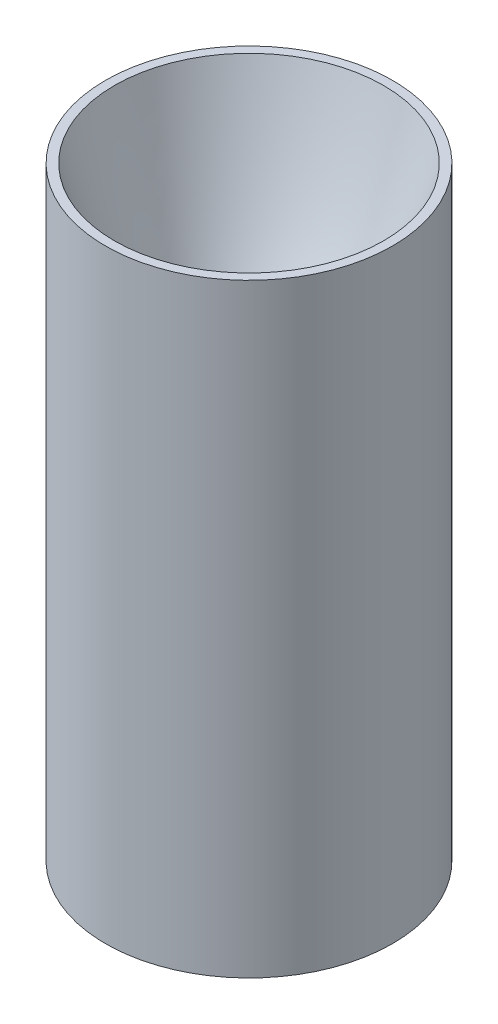
ISO-10303-21;
HEADER;
FILE_DESCRIPTION(('STEP AP214'),'2;1');
FILE_NAME('part.step','',(''),(''),'','','');
FILE_SCHEMA(('AUTOMOTIVE_DESIGN { 1 0 10303 214 1 1 1 1 }'));
ENDSEC;
DATA;
#1=APPLICATION_CONTEXT('core data for automotive mechanical design processes');
#2=APPLICATION_PROTOCOL_DEFINITION('international standard','automotive_design',2000,#1);
#3=PRODUCT_CONTEXT('',#1,'mechanical');
#4=PRODUCT('Part','Part','',(#3));
#5=PRODUCT_RELATED_PRODUCT_CATEGORY('part','',(#4));
#6=PRODUCT_DEFINITION_FORMATION('','',#4);
#7=PRODUCT_DEFINITION_CONTEXT('part definition',#1,'design');
#8=PRODUCT_DEFINITION('design','',#6,#7);
#9=PRODUCT_DEFINITION_SHAPE('','',#8);
#10=(LENGTH_UNIT() NAMED_UNIT(*) SI_UNIT(.MILLI.,.METRE.));
#11=(NAMED_UNIT(*) PLANE_ANGLE_UNIT() SI_UNIT($,.RADIAN.));
#12=(NAMED_UNIT(*) SI_UNIT($,.STERADIAN.) SOLID_ANGLE_UNIT());
#13=UNCERTAINTY_MEASURE_WITH_UNIT(LENGTH_MEASURE(1.E-05),#10,'distance_accuracy_value','');
#14=(GEOMETRIC_REPRESENTATION_CONTEXT(3) GLOBAL_UNCERTAINTY_ASSIGNED_CONTEXT((#13)) GLOBAL_UNIT_ASSIGNED_CONTEXT((#10,
#11,#12)) REPRESENTATION_CONTEXT('',''));
#15=CARTESIAN_POINT('',(0.,0.,0.));
#16=DIRECTION('',(0.,0.,1.));
#17=DIRECTION('',(1.,0.,0.));
#18=AXIS2_PLACEMENT_3D('',#15,#16,#17);
#19=CARTESIAN_POINT('',(-0.00553212594954357,165.815985113531,0.));
#20=DIRECTION('',(0.,1.,0.));
#21=DIRECTION('',(-1.,0.,0.));
#22=AXIS2_PLACEMENT_3D('',#19,#20,#21);
#23=CYLINDRICAL_SURFACE('',#22,53.8870597874087);
#24=CARTESIAN_POINT('',(-0.00553212594952976,-59.7275132222084,0.));
#25=DIRECTION('',(0.,1.,0.));
#26=DIRECTION('',(-1.,0.,0.));
#27=AXIS2_PLACEMENT_3D('',#24,#25,#26);
#28=CIRCLE('',#27,53.8870597874087);
#29=CARTESIAN_POINT('',(-53.8925919133582,-59.7275132222084,0.));
#30=VERTEX_POINT('',#29);
#31=EDGE_CURVE('E214',#30,#30,#28,.T.);
#32=ORIENTED_EDGE('',*,*,#31,.T.);
#33=EDGE_LOOP('',(#32));
#34=FACE_BOUND('',#33,.T.);
#35=CARTESIAN_POINT('',(-0.00553212594952079,-206.127513222208,0.));
#36=DIRECTION('',(0.,-1.,0.));
#37=DIRECTION('',(1.,0.,0.));
#38=AXIS2_PLACEMENT_3D('',#35,#36,#37);
#39=CIRCLE('',#38,53.8870597874087);
#40=CARTESIAN_POINT('',(53.8815276614592,-206.127513222208,0.));
#41=VERTEX_POINT('',#40);
#42=EDGE_CURVE('E49',#41,#41,#39,.F.);
#43=ORIENTED_EDGE('',*,*,#42,.F.);
#44=EDGE_LOOP('',(#43));
#45=FACE_BOUND('',#44,.T.);
#46=ADVANCED_FACE('F44',(#34,#45),#23,.F.);
#47=CARTESIAN_POINT('',(26.7952792027638,6.50940032261705,0.));
#48=CARTESIAN_POINT('',(26.7445202608389,6.45863951352258,0.));
#49=CARTESIAN_POINT('',(26.6704420702071,6.38228245129657,0.));
#50=CARTESIAN_POINT('',(26.5045552478799,6.20880231838131,0.));
#51=CARTESIAN_POINT('',(26.3663457558084,6.0501123088261,0.));
#52=CARTESIAN_POINT('',(26.1788763741962,5.83307431955689,0.));
#53=CARTESIAN_POINT('',(26.0044054743904,5.61088821502492,0.));
#54=CARTESIAN_POINT('',(25.7917882699891,5.32567960819241,0.));
#55=CARTESIAN_POINT('',(25.6025147209982,5.0458645334822,0.));
#56=CARTESIAN_POINT('',(25.41648850457,4.75146224774109,0.));
#57=CARTESIAN_POINT('',(25.2460122224941,4.45494379501456,0.));
#58=CARTESIAN_POINT('',(25.0840703005529,4.14944285659226,0.));
#59=CARTESIAN_POINT('',(24.935285976811,3.8398274049797,0.));
#60=CARTESIAN_POINT('',(24.7971967711735,3.52378782945289,0.));
#61=CARTESIAN_POINT('',(24.6716190705559,3.20350771325653,0.));
#62=CARTESIAN_POINT('',(24.5577414131155,2.87825331698411,0.));
#63=CARTESIAN_POINT('',(24.4563235712815,2.54940009295196,0.));
#64=CARTESIAN_POINT('',(24.3671416013245,2.21651509223236,0.));
#65=CARTESIAN_POINT('',(24.2905437014453,1.88115744920019,0.));
#66=CARTESIAN_POINT('',(24.2264993053653,1.54221117006489,0.));
#67=CARTESIAN_POINT('',(24.1751847188441,1.20269794512489,0.));
#68=CARTESIAN_POINT('',(24.1414350870908,0.90159400009664,0.));
#69=CARTESIAN_POINT('',(24.1205335987741,0.646924938525799,0.));
#70=CARTESIAN_POINT('',(24.1084615678794,0.427224789349872,0.));
#71=CARTESIAN_POINT('',(24.1020237227721,0.267801741635842,0.));
#72=CARTESIAN_POINT('',(24.099606331446,0.110274361763279,0.));
#73=CARTESIAN_POINT('',(24.0990685004946,0.0360533244193808,0.));
#74=CARTESIAN_POINT('',(24.0990678740505,0.000160672239889663,0.));
#75=B_SPLINE_CURVE_WITH_KNOTS('',4,(#47,#48,#49,#50,#51,#52,#53,#54,#55,#56,#57,#58,#59,#60,#61,
#62,#63,#64,#65,#66,#67,#68,#69,#70,#71,#72,#73,#74),.UNSPECIFIED.,.F.,.F.,(5,1,1,1,1,1,1,1,1,1,
1,1,1,1,1,1,1,1,1,1,1,1,1,1,5),(0.0825688161645696,0.122284452541055,0.142142270729318,
0.162000088917581,0.201715725294151,0.241431361670644,0.281146998047181,0.320862634423759,
0.360578270800262,0.400293907176806,0.440009543553384,0.479725179929891,0.519440816306429,
0.55915645268299,0.598872089059496,0.638587725436031,0.678303361812587,0.718018998189109,
0.75773463456565,0.797450270942201,0.837165907318734,0.857023725507005,0.876881543695275,
0.896739361883545,0.916597180071815),.UNSPECIFIED.);
#76=CARTESIAN_POINT('',(-0.00553212594954357,165.815985113531,0.));
#77=DIRECTION('',(0.,1.,0.));
#78=AXIS1_PLACEMENT('',#76,#77);
#79=SURFACE_OF_REVOLUTION('',#75,#78);
#80=CARTESIAN_POINT('',(-0.00553212594953341,0.000160668806897801,0.));
#81=DIRECTION('',(0.,1.,0.));
#82=DIRECTION('',(-1.,0.,0.));
#83=AXIS2_PLACEMENT_3D('',#80,#81,#82);
#84=CIRCLE('',#83,24.1046000000001);
#85=CARTESIAN_POINT('',(-24.1101321259496,0.000160668806896325,0.));
#86=VERTEX_POINT('',#85);
#87=EDGE_CURVE('E11',#86,#86,#84,.T.);
#88=ORIENTED_EDGE('',*,*,#87,.F.);
#89=EDGE_LOOP('',(#88));
#90=FACE_BOUND('',#89,.T.);
#91=CARTESIAN_POINT('',(-0.00553212594953381,6.50940032262515,0.));
#92=DIRECTION('',(0.,1.,0.));
#93=DIRECTION('',(-1.,0.,0.));
#94=AXIS2_PLACEMENT_3D('',#91,#92,#93);
#95=CIRCLE('',#94,26.8008113287012);
#96=CARTESIAN_POINT('',(-26.8063434546508,6.50940032262515,0.));
#97=VERTEX_POINT('',#96);
#98=EDGE_CURVE('E140',#97,#97,#95,.T.);
#99=ORIENTED_EDGE('',*,*,#98,.T.);
#100=EDGE_LOOP('',(#99));
#101=FACE_BOUND('',#100,.T.);
#102=ADVANCED_FACE('F46',(#90,#101),#79,.T.);
#103=CARTESIAN_POINT('',(24.0990678740505,0.000160668806908237,0.));
#104=CARTESIAN_POINT('',(24.0990691047264,-0.0703679737352121,0.));
#105=CARTESIAN_POINT('',(24.0995982518238,-0.213423516364572,0.));
#106=CARTESIAN_POINT('',(24.1019739368555,-0.54302224256361,0.));
#107=CARTESIAN_POINT('',(24.108298330907,-0.823999723304706,0.));
#108=CARTESIAN_POINT('',(24.1177834518131,-1.19466139823137,0.));
#109=CARTESIAN_POINT('',(24.1304257444764,-1.51327438485323,0.));
#110=CARTESIAN_POINT('',(24.1462259682127,-1.86177892979882,0.));
#111=CARTESIAN_POINT('',(24.1651812265557,-2.19354619837348,0.));
#112=CARTESIAN_POINT('',(24.1928188404899,-2.61790872656857,0.));
#113=CARTESIAN_POINT('',(24.2322870469681,-3.12187327355973,0.));
#114=CARTESIAN_POINT('',(24.3032997069299,-3.87981800184723,0.));
#115=CARTESIAN_POINT('',(24.4231266778129,-4.88628971541376,0.));
#116=CARTESIAN_POINT('',(24.5994860436425,-6.05655008801696,0.));
#117=CARTESIAN_POINT('',(24.8508852327055,-7.38500574307494,0.));
#118=CARTESIAN_POINT('',(25.1517953130835,-8.7034138434872,0.));
#119=CARTESIAN_POINT('',(25.5017706231346,-10.0094765384076,0.));
#120=CARTESIAN_POINT('',(25.9003609832371,-11.3016589273833,0.));
#121=CARTESIAN_POINT('',(26.3469453915683,-12.5779386666623,0.));
#122=CARTESIAN_POINT('',(26.8410033225458,-13.8367268168494,0.));
#123=CARTESIAN_POINT('',(27.3816731216984,-15.0760364628828,0.));
#124=CARTESIAN_POINT('',(27.9684793864403,-16.2944491292128,0.));
#125=CARTESIAN_POINT('',(28.6001393975275,-17.4897781307818,0.));
#126=CARTESIAN_POINT('',(29.2765323957794,-18.6611270954326,0.));
#127=CARTESIAN_POINT('',(29.9954451018022,-19.8055827365355,0.));
#128=CARTESIAN_POINT('',(30.7580219993831,-20.9236994165562,0.));
#129=CARTESIAN_POINT('',(31.4591671926042,-21.8742511036734,0.));
#130=CARTESIAN_POINT('',(32.088736122994,-22.6732848253228,0.));
#131=CARTESIAN_POINT('',(32.6241284164022,-23.3202614843186,0.));
#132=CARTESIAN_POINT('',(33.0722557680798,-23.8398443636278,0.));
#133=CARTESIAN_POINT('',(33.5084500261274,-24.3296555943667,0.));
#134=CARTESIAN_POINT('',(33.9358261213152,-24.7883237389104,0.));
#135=CARTESIAN_POINT('',(34.2455586397423,-25.1137076600497,0.));
#136=CARTESIAN_POINT('',(34.536859957545,-25.4094883973448,0.));
#137=CARTESIAN_POINT('',(34.6364124254986,-25.5097892828568,0.));
#138=CARTESIAN_POINT('',(34.6862828032075,-25.5596614679656,0.));
#139=B_SPLINE_CURVE_WITH_KNOTS('',4,(#103,#104,#105,#106,#107,#108,#109,#110,#111,#112,#113,
#114,#115,#116,#117,#118,#119,#120,#121,#122,#123,#124,#125,#126,#127,#128,#129,#130,#131,#132,
#133,#134,#135,#136,#137,#138),.UNSPECIFIED.,.F.,.F.,(5,1,1,1,1,1,1,1,1,1,1,1,1,1,1,1,1,1,1,1,1,
1,1,1,1,1,1,1,1,1,1,1,5),(0.0826377293963901,0.0925749264345495,0.10251212335078,
0.11244932026701,0.122386517183241,0.132323714099471,0.142260911015702,0.152198107931932,
0.162135304848163,0.182009698680624,0.201884092513085,0.241632880178006,0.281381667842927,
0.321130455507848,0.360879243172768,0.400628030837689,0.44037681850261,0.480125606167531,
0.519874393832452,0.559623181497373,0.599371969162294,0.639120756827214,0.678869544492136,
0.718618332157059,0.758367119821983,0.798115907486907,0.817990301319368,0.837864695151829,
0.857739088984291,0.877613482816753,0.897487876649217,0.907425073565449,0.917362270357466),.UNSPECIFIED.);
#140=CARTESIAN_POINT('',(-0.00553212594954357,165.815985113531,0.));
#141=DIRECTION('',(0.,1.,0.));
#142=AXIS1_PLACEMENT('',#140,#141);
#143=SURFACE_OF_REVOLUTION('',#139,#142);
#144=CARTESIAN_POINT('',(-0.00553212594953185,-25.5596614655476,0.));
#145=DIRECTION('',(0.,1.,0.));
#146=DIRECTION('',(-1.,0.,0.));
#147=AXIS2_PLACEMENT_3D('',#144,#145,#146);
#148=CIRCLE('',#147,34.6918149267068);
#149=CARTESIAN_POINT('',(-34.6973470526563,-25.5596614655476,0.));
#150=VERTEX_POINT('',#149);
#151=EDGE_CURVE('E55',#150,#150,#148,.T.);
#152=ORIENTED_EDGE('',*,*,#151,.F.);
#153=EDGE_LOOP('',(#152));
#154=FACE_BOUND('',#153,.T.);
#155=ORIENTED_EDGE('',*,*,#87,.T.);
#156=EDGE_LOOP('',(#155));
#157=FACE_BOUND('',#156,.T.);
#158=ADVANCED_FACE('F159',(#154,#157),#143,.T.);
#159=CARTESIAN_POINT('',(-0.00553212594953185,-25.5596614655476,0.));
#160=DIRECTION('',(0.,-1.,0.));
#161=DIRECTION('',(1.,0.,0.));
#162=AXIS2_PLACEMENT_3D('',#159,#160,#161);
#163=CONICAL_SURFACE('',#162,34.6918149267068,0.785398163436923);
#164=CARTESIAN_POINT('',(-0.00553212594953132,-34.1672896564155,0.));
#165=DIRECTION('',(0.,1.,0.));
#166=DIRECTION('',(-1.,0.,0.));
#167=AXIS2_PLACEMENT_3D('',#164,#165,#166);
#168=CIRCLE('',#167,43.2994431182542);
#169=CARTESIAN_POINT('',(-43.3049752442037,-34.1672896564155,0.));
#170=VERTEX_POINT('',#169);
#171=EDGE_CURVE('E218',#170,#170,#168,.T.);
#172=ORIENTED_EDGE('',*,*,#171,.F.);
#173=EDGE_LOOP('',(#172));
#174=FACE_BOUND('',#173,.T.);
#175=ORIENTED_EDGE('',*,*,#151,.T.);
#176=EDGE_LOOP('',(#175));
#177=FACE_BOUND('',#176,.T.);
#178=ADVANCED_FACE('F162',(#174,#177),#163,.F.);
#179=CARTESIAN_POINT('',(43.2939109923046,-34.1672896564155,0.));
#180=CARTESIAN_POINT('',(43.3437831513223,-34.2171620551714,0.));
#181=CARTESIAN_POINT('',(43.4443920727492,-34.3185162876524,0.));
#182=CARTESIAN_POINT('',(43.6740724065625,-34.5515494508273,0.));
#183=CARTESIAN_POINT('',(43.8739246242924,-34.7603401511495,0.));
#184=CARTESIAN_POINT('',(44.1814575029394,-35.0846311851452,0.));
#185=CARTESIAN_POINT('',(44.5147761897921,-35.4469926571794,0.));
#186=CARTESIAN_POINT('',(44.9151269482091,-35.8942476326121,0.));
#187=CARTESIAN_POINT('',(45.3528176805606,-36.4033812820872,0.));
#188=CARTESIAN_POINT('',(45.8935379372936,-37.0556721225026,0.));
#189=CARTESIAN_POINT('',(46.5198690603663,-37.8514517850733,0.));
#190=CARTESIAN_POINT('',(47.2231021380089,-38.8040762391045,0.));
#191=CARTESIAN_POINT('',(47.9844755196269,-39.9209726571504,0.));
#192=CARTESIAN_POINT('',(48.7041252288017,-41.0661548789494,0.));
#193=CARTESIAN_POINT('',(49.3801202305322,-42.237093238969,0.));
#194=CARTESIAN_POINT('',(50.0120609277141,-43.4327015259013,0.));
#195=CARTESIAN_POINT('',(50.5987337525416,-44.6509688035954,0.));
#196=CARTESIAN_POINT('',(51.1395203608935,-45.8904084054128,0.));
#197=CARTESIAN_POINT('',(51.6335378309109,-47.1491350671244,0.));
#198=CARTESIAN_POINT('',(52.0243487391707,-48.2659692236755,0.));
#199=CARTESIAN_POINT('',(52.3292893402464,-49.2330777402432,0.));
#200=CARTESIAN_POINT('',(52.6100142242714,-50.2074890382386,0.));
#201=CARTESIAN_POINT('',(52.8663751202277,-51.1885390834316,0.));
#202=CARTESIAN_POINT('',(53.0920641868644,-52.1774428213628,0.));
#203=CARTESIAN_POINT('',(53.286810822161,-53.1724252398257,0.));
#204=CARTESIAN_POINT('',(53.4566757862888,-54.1724354302666,0.));
#205=CARTESIAN_POINT('',(53.5774268613503,-55.0081658604085,0.));
#206=CARTESIAN_POINT('',(53.6772884517024,-55.8484803658293,0.));
#207=CARTESIAN_POINT('',(53.7561931214081,-56.6879981651896,0.));
#208=CARTESIAN_POINT('',(53.8004052846286,-57.2809598991543,0.));
#209=CARTESIAN_POINT('',(53.8304176255881,-57.78159444267,0.));
#210=CARTESIAN_POINT('',(53.8501684533724,-58.2128376217517,0.));
#211=CARTESIAN_POINT('',(53.8628113509311,-58.532567487684,0.));
#212=CARTESIAN_POINT('',(53.8722968380062,-58.9047954926748,0.));
#213=CARTESIAN_POINT('',(53.8786214368661,-59.1815646164516,0.));
#214=CARTESIAN_POINT('',(53.8809972871444,-59.5154061029223,0.));
#215=CARTESIAN_POINT('',(53.8815264301114,-59.6569831565778,0.));
#216=CARTESIAN_POINT('',(53.881527661459,-59.7275132097554,0.));
#217=B_SPLINE_CURVE_WITH_KNOTS('',4,(#179,#180,#181,#182,#183,#184,#185,#186,#187,#188,#189,
#190,#191,#192,#193,#194,#195,#196,#197,#198,#199,#200,#201,#202,#203,#204,#205,#206,#207,#208,
#209,#210,#211,#212,#213,#214,#215,#216),.UNSPECIFIED.,.F.,.F.,(5,1,1,1,1,1,1,1,1,1,1,1,1,1,1,1,
1,1,1,1,1,1,1,1,1,1,1,1,1,1,1,1,1,1,5),(0.0826377290758682,0.092574925554141,0.102512122470373,
0.112449319386606,0.122386516302838,0.142260910135299,0.162135303967759,0.18200969780022,
0.201884091632681,0.241632879297603,0.281381666962524,0.321130454627446,0.360879242292367,
0.400628029957289,0.440376817622211,0.480125605287132,0.519874392952054,0.559623180616974,
0.599371968281896,0.619246362114357,0.639120755946818,0.67886954361174,0.718618331276661,
0.738492725109122,0.758367118941582,0.798115906606503,0.817990300438964,0.837864694271425,
0.857739088103886,0.867676285020117,0.877613481936347,0.887550678852578,0.897487875768808,
0.907425072685039,0.917362270043718),.UNSPECIFIED.);
#218=CARTESIAN_POINT('',(-0.00553212594954357,165.815985113531,0.));
#219=DIRECTION('',(0.,1.,0.));
#220=AXIS1_PLACEMENT('',#218,#219);
#221=SURFACE_OF_REVOLUTION('',#217,#220);
#222=ORIENTED_EDGE('',*,*,#31,.F.);
#223=EDGE_LOOP('',(#222));
#224=FACE_BOUND('',#223,.T.);
#225=ORIENTED_EDGE('',*,*,#171,.T.);
#226=EDGE_LOOP('',(#225));
#227=FACE_BOUND('',#226,.T.);
#228=ADVANCED_FACE('F166',(#224,#227),#221,.T.);
#229=CARTESIAN_POINT('',(76.4900236023066,-212.127513222208,0.));
#230=DIRECTION('',(0.,1.,0.));
#231=DIRECTION('',(-1.,0.,0.));
#232=AXIS2_PLACEMENT_3D('',#229,#230,#231);
#233=PLANE('',#232);
#234=CARTESIAN_POINT('',(0.,-212.127513222208,0.));
#235=DIRECTION('',(0.,-1.,0.));
#236=DIRECTION('',(1.,0.,0.));
#237=AXIS2_PLACEMENT_3D('',#234,#235,#236);
#238=CIRCLE('',#237,56.8815276614404);
#239=CARTESIAN_POINT('',(56.8815276614404,-212.127513222208,0.));
#240=VERTEX_POINT('',#239);
#241=EDGE_CURVE('E102',#240,#240,#238,.T.);
#242=ORIENTED_EDGE('',*,*,#241,.F.);
#243=EDGE_LOOP('',(#242));
#244=FACE_BOUND('',#243,.T.);
#245=CARTESIAN_POINT('',(46.1032838079609,-212.127513222208,46.1035512337718));
#246=DIRECTION('',(0.,1.,0.));
#247=DIRECTION('',(0.38268343232144,0.,-0.923879532529367));
#248=AXIS2_PLACEMENT_3D('',#245,#246,#247);
#249=ELLIPSE('',#248,4.21640000033001,4.21639999999999);
#250=CARTESIAN_POINT('',(47.7168302321273,-212.127513222208,42.20810557251));
#251=VERTEX_POINT('',#250);
#252=EDGE_CURVE('E92',#251,#251,#249,.T.);
#253=ORIENTED_EDGE('',*,*,#252,.T.);
#254=EDGE_LOOP('',(#253));
#255=FACE_BOUND('',#254,.T.);
#256=CARTESIAN_POINT('',(-0.000267431971473179,-212.127513222208,65.2002674406839));
#257=DIRECTION('',(0.,1.,0.));
#258=DIRECTION('',(0.707106781139304,0.,-0.707106781233791));
#259=AXIS2_PLACEMENT_3D('',#256,#257,#258);
#260=ELLIPSE('',#259,4.21640000112674,4.21639999999999);
#261=CARTESIAN_POINT('',(2.98117760082102,-212.127513222208,62.2188224074931));
#262=VERTEX_POINT('',#261);
#263=EDGE_CURVE('E107',#262,#262,#260,.T.);
#264=ORIENTED_EDGE('',*,*,#263,.T.);
#265=EDGE_LOOP('',(#264));
#266=FACE_BOUND('',#265,.T.);
#267=CARTESIAN_POINT('',(-46.1038186893277,-212.127513222208,46.1035512511962));
#268=DIRECTION('',(0.,1.,0.));
#269=DIRECTION('',(0.923879532493207,0.,-0.382683432408738));
#270=AXIS2_PLACEMENT_3D('',#267,#268,#269);
#271=ELLIPSE('',#270,4.21640000192348,4.21639999999999);
#272=CARTESIAN_POINT('',(-42.2083730267463,-212.127513222208,44.4900048260519));
#273=VERTEX_POINT('',#272);
#274=EDGE_CURVE('E112',#273,#273,#271,.T.);
#275=ORIENTED_EDGE('',*,*,#274,.T.);
#276=EDGE_LOOP('',(#275));
#277=FACE_BOUND('',#276,.T.);
#278=CARTESIAN_POINT('',(-65.2005348987914,-212.127513222208,0.));
#279=DIRECTION('',(0.,1.,0.));
#280=DIRECTION('',(1.,0.,0.));
#281=AXIS2_PLACEMENT_3D('',#278,#279,#280);
#282=ELLIPSE('',#281,4.21640000225349,4.21639999999999);
#283=CARTESIAN_POINT('',(-60.9841348965379,-212.127513222208,0.));
#284=VERTEX_POINT('',#283);
#285=EDGE_CURVE('E117',#284,#284,#282,.T.);
#286=ORIENTED_EDGE('',*,*,#285,.T.);
#287=EDGE_LOOP('',(#286));
#288=FACE_BOUND('',#287,.T.);
#289=CARTESIAN_POINT('',(-46.1038186893284,-212.127513222208,-46.1035512511956));
#290=DIRECTION('',(0.,1.,0.));
#291=DIRECTION('',(0.92387953249321,0.,0.382683432408731));
#292=AXIS2_PLACEMENT_3D('',#289,#290,#291);
#293=ELLIPSE('',#292,4.21640000192348,4.21639999999999);
#294=CARTESIAN_POINT('',(-42.2083730267469,-212.127513222208,-44.4900048260513));
#295=VERTEX_POINT('',#294);
#296=EDGE_CURVE('E122',#295,#295,#293,.T.);
#297=ORIENTED_EDGE('',*,*,#296,.T.);
#298=EDGE_LOOP('',(#297));
#299=FACE_BOUND('',#298,.T.);
#300=CARTESIAN_POINT('',(-0.000267431972383761,-212.127513222208,-65.2002674406839));
#301=DIRECTION('',(0.,1.,0.));
#302=DIRECTION('',(0.707106781139309,0.,0.707106781233786));
#303=AXIS2_PLACEMENT_3D('',#300,#301,#302);
#304=ELLIPSE('',#303,4.21640000112674,4.21639999999999);
#305=CARTESIAN_POINT('',(2.98117760082012,-212.127513222208,-62.2188224074931));
#306=VERTEX_POINT('',#305);
#307=EDGE_CURVE('E127',#306,#306,#304,.T.);
#308=ORIENTED_EDGE('',*,*,#307,.T.);
#309=EDGE_LOOP('',(#308));
#310=FACE_BOUND('',#309,.T.);
#311=CARTESIAN_POINT('',(46.1032838079602,-212.127513222208,-46.1035512337724));
#312=DIRECTION('',(0.,1.,0.));
#313=DIRECTION('',(0.382683432321446,0.,0.923879532529364));
#314=AXIS2_PLACEMENT_3D('',#311,#312,#313);
#315=ELLIPSE('',#314,4.21640000033001,4.21639999999999);
#316=CARTESIAN_POINT('',(47.7168302321267,-212.127513222208,-42.2081055725107));
#317=VERTEX_POINT('',#316);
#318=EDGE_CURVE('E132',#317,#317,#315,.T.);
#319=ORIENTED_EDGE('',*,*,#318,.T.);
#320=EDGE_LOOP('',(#319));
#321=FACE_BOUND('',#320,.T.);
#322=CARTESIAN_POINT('',(65.2,-212.127513222208,0.));
#323=DIRECTION('',(0.,-1.,0.));
#324=DIRECTION('',(0.,0.,-1.));
#325=AXIS2_PLACEMENT_3D('',#322,#323,#324);
#326=CIRCLE('',#325,4.21639999999999);
#327=CARTESIAN_POINT('',(65.2,-212.127513222208,-4.21639999999999));
#328=VERTEX_POINT('',#327);
#329=EDGE_CURVE('E133',#328,#328,#326,.T.);
#330=ORIENTED_EDGE('',*,*,#329,.F.);
#331=EDGE_LOOP('',(#330));
#332=FACE_BOUND('',#331,.T.);
#333=CARTESIAN_POINT('',(-0.00553212594952042,-212.127513222208,0.));
#334=DIRECTION('',(0.,1.,0.));
#335=DIRECTION('',(-1.,0.,0.));
#336=AXIS2_PLACEMENT_3D('',#333,#334,#335);
#337=CIRCLE('',#336,76.4955557282561);
#338=CARTESIAN_POINT('',(-76.5010878542056,-212.127513222208,0.));
#339=VERTEX_POINT('',#338);
#340=EDGE_CURVE('E210',#339,#339,#337,.T.);
#341=ORIENTED_EDGE('',*,*,#340,.F.);
#342=EDGE_LOOP('',(#341));
#343=FACE_BOUND('',#342,.T.);
#344=ADVANCED_FACE('F170',(#244,#255,#266,#277,#288,#299,#310,#321,#332,#343),#233,.F.);
#345=CARTESIAN_POINT('',(-0.00553212594954357,165.815985113531,0.));
#346=DIRECTION('',(0.,1.,0.));
#347=DIRECTION('',(-1.,0.,0.));
#348=AXIS2_PLACEMENT_3D('',#345,#346,#347);
#349=CYLINDRICAL_SURFACE('',#348,76.4955557282561);
#350=CARTESIAN_POINT('',(-0.00553212594954014,109.927507640521,0.));
#351=DIRECTION('',(0.,1.,0.));
#352=DIRECTION('',(-1.,0.,0.));
#353=AXIS2_PLACEMENT_3D('',#350,#351,#352);
#354=CIRCLE('',#353,76.4955557282561);
#355=CARTESIAN_POINT('',(-76.5010878542057,109.927507640521,0.));
#356=VERTEX_POINT('',#355);
#357=EDGE_CURVE('E206',#356,#356,#354,.T.);
#358=ORIENTED_EDGE('',*,*,#357,.F.);
#359=EDGE_LOOP('',(#358));
#360=FACE_BOUND('',#359,.T.);
#361=ORIENTED_EDGE('',*,*,#340,.T.);
#362=EDGE_LOOP('',(#361));
#363=FACE_BOUND('',#362,.T.);
#364=ADVANCED_FACE('F177',(#360,#363),#349,.T.);
#365=CARTESIAN_POINT('',(71.7275236023065,109.927507640521,0.));
#366=DIRECTION('',(0.,-1.,0.));
#367=DIRECTION('',(1.,0.,0.));
#368=AXIS2_PLACEMENT_3D('',#365,#366,#367);
#369=PLANE('',#368);
#370=CARTESIAN_POINT('',(-0.00553212594954014,109.927507640521,0.));
#371=DIRECTION('',(0.,1.,0.));
#372=DIRECTION('',(-1.,0.,0.));
#373=AXIS2_PLACEMENT_3D('',#370,#371,#372);
#374=CIRCLE('',#373,71.7330557282561);
#375=CARTESIAN_POINT('',(-71.7385878542057,109.927507640521,0.));
#376=VERTEX_POINT('',#375);
#377=EDGE_CURVE('E202',#376,#376,#374,.T.);
#378=ORIENTED_EDGE('',*,*,#377,.F.);
#379=EDGE_LOOP('',(#378));
#380=FACE_BOUND('',#379,.T.);
#381=ORIENTED_EDGE('',*,*,#357,.T.);
#382=EDGE_LOOP('',(#381));
#383=FACE_BOUND('',#382,.T.);
#384=ADVANCED_FACE('F181',(#380,#383),#369,.F.);
#385=CARTESIAN_POINT('',(71.7275236023066,109.927507640521,0.));
#386=CARTESIAN_POINT('',(49.2614014026307,34.6361148417855,0.));
#387=CARTESIAN_POINT('',(26.7952792027517,6.50940032262514,0.));
#388=B_SPLINE_CURVE_WITH_KNOTS('',2,(#385,#386,#387),.UNSPECIFIED.,.F.,.F.,(3,3),(0.,1.),.UNSPECIFIED.);
#389=CARTESIAN_POINT('',(-0.00553212594954357,165.815985113531,0.));
#390=DIRECTION('',(0.,1.,0.));
#391=AXIS1_PLACEMENT('',#389,#390);
#392=SURFACE_OF_REVOLUTION('',#388,#391);
#393=ORIENTED_EDGE('',*,*,#98,.F.);
#394=EDGE_LOOP('',(#393));
#395=FACE_BOUND('',#394,.T.);
#396=ORIENTED_EDGE('',*,*,#377,.T.);
#397=EDGE_LOOP('',(#396));
#398=FACE_BOUND('',#397,.T.);
#399=ADVANCED_FACE('F185',(#395,#398),#392,.T.);
#400=CARTESIAN_POINT('',(65.2,-187.127513222208,0.));
#401=DIRECTION('',(0.,-1.,0.));
#402=DIRECTION('',(0.,0.,-1.));
#403=AXIS2_PLACEMENT_3D('',#400,#401,#402);
#404=CONICAL_SURFACE('',#403,4.21639999999999,1.02974425867665);
#405=CARTESIAN_POINT('',(65.2,-184.594044508141,0.));
#406=VERTEX_POINT('',#405);
#407=VERTEX_LOOP('',#406);
#408=FACE_BOUND('',#407,.T.);
#409=CARTESIAN_POINT('',(65.2,-187.127513222208,0.));
#410=DIRECTION('',(0.,-1.,0.));
#411=DIRECTION('',(0.,0.,-1.));
#412=AXIS2_PLACEMENT_3D('',#409,#410,#411);
#413=CIRCLE('',#412,4.21639999999999);
#414=CARTESIAN_POINT('',(65.2,-187.127513222208,-4.21639999999999));
#415=VERTEX_POINT('',#414);
#416=EDGE_CURVE('E137',#415,#415,#413,.T.);
#417=ORIENTED_EDGE('',*,*,#416,.T.);
#418=EDGE_LOOP('',(#417));
#419=FACE_BOUND('',#418,.T.);
#420=ADVANCED_FACE('F189',(#408,#419),#404,.F.);
#421=CARTESIAN_POINT('',(65.2,-212.127513222208,0.));
#422=DIRECTION('',(0.,-1.,0.));
#423=DIRECTION('',(0.,0.,-1.));
#424=AXIS2_PLACEMENT_3D('',#421,#422,#423);
#425=CYLINDRICAL_SURFACE('',#424,4.21639999999999);
#426=ORIENTED_EDGE('',*,*,#416,.F.);
#427=EDGE_LOOP('',(#426));
#428=FACE_BOUND('',#427,.T.);
#429=ORIENTED_EDGE('',*,*,#329,.T.);
#430=EDGE_LOOP('',(#429));
#431=FACE_BOUND('',#430,.T.);
#432=ADVANCED_FACE('F295',(#428,#431),#425,.F.);
#433=CARTESIAN_POINT('',(46.1032838094549,-212.127825399818,-46.1035512301639));
#434=DIRECTION('',(4.78798051518147E-06,-0.99999999992173,1.15592074975258E-05));
#435=DIRECTION('',(0.,-1.15592074976583E-05,-0.999999999933193));
#436=AXIS2_PLACEMENT_3D('',#433,#434,#435);
#437=CYLINDRICAL_SURFACE('',#436,4.21639999999999);
#438=CARTESIAN_POINT('',(46.103164109942,-187.127825401775,-46.1038402103513));
#439=DIRECTION('',(4.78798051518147E-06,-0.99999999992173,1.15592074975258E-05));
#440=DIRECTION('',(0.,-1.15592074976583E-05,-0.999999999933193));
#441=AXIS2_PLACEMENT_3D('',#438,#439,#440);
#442=CIRCLE('',#441,4.2164);
#443=CARTESIAN_POINT('',(46.103164109942,-187.127874140018,-50.3202402100696));
#444=VERTEX_POINT('',#443);
#445=EDGE_CURVE('E128',#444,#444,#442,.T.);
#446=ORIENTED_EDGE('',*,*,#445,.F.);
#447=EDGE_LOOP('',(#446));
#448=FACE_BOUND('',#447,.T.);
#449=ORIENTED_EDGE('',*,*,#318,.F.);
#450=EDGE_LOOP('',(#449));
#451=FACE_BOUND('',#450,.T.);
#452=ADVANCED_FACE('F292',(#448,#451),#437,.F.);
#453=CARTESIAN_POINT('',(46.103164109942,-187.127825401775,-46.1038402103513));
#454=DIRECTION('',(4.78798051518147E-06,-0.99999999992173,1.15592074975258E-05));
#455=DIRECTION('',(0.,-1.15592074976583E-05,-0.999999999933193));
#456=AXIS2_PLACEMENT_3D('',#453,#454,#455);
#457=CONICAL_SURFACE('',#456,4.2164,1.02974425867665);
#458=CARTESIAN_POINT('',(46.1031519797432,-184.594356687906,-46.1038694952419));
#459=VERTEX_POINT('',#458);
#460=VERTEX_LOOP('',#459);
#461=FACE_BOUND('',#460,.T.);
#462=ORIENTED_EDGE('',*,*,#445,.T.);
#463=EDGE_LOOP('',(#462));
#464=FACE_BOUND('',#463,.T.);
#465=ADVANCED_FACE('F290',(#461,#464),#457,.F.);
#466=CARTESIAN_POINT('',(-0.000267414548880048,-212.128579063238,-65.2002674232604));
#467=DIRECTION('',(1.63471880111628E-05,-0.99999999973277,1.63471880132858E-05));
#468=DIRECTION('',(0.,-1.634718801547E-05,-0.999999999866385));
#469=AXIS2_PLACEMENT_3D('',#466,#467,#468);
#470=CYLINDRICAL_SURFACE('',#469,4.21639999999999);
#471=CARTESIAN_POINT('',(-0.000676094249159119,-187.128579069919,-65.2006761029608));
#472=DIRECTION('',(1.63471880111628E-05,-0.99999999973277,1.63471880132858E-05));
#473=DIRECTION('',(0.,-1.634718801547E-05,-0.999999999866385));
#474=AXIS2_PLACEMENT_3D('',#471,#472,#473);
#475=CIRCLE('',#474,4.2164);
#476=CARTESIAN_POINT('',(-0.000676094249159119,-187.128647996203,-69.4170761023974));
#477=VERTEX_POINT('',#476);
#478=EDGE_CURVE('E123',#477,#477,#475,.T.);
#479=ORIENTED_EDGE('',*,*,#478,.F.);
#480=EDGE_LOOP('',(#479));
#481=FACE_BOUND('',#480,.T.);
#482=ORIENTED_EDGE('',*,*,#307,.F.);
#483=EDGE_LOOP('',(#482));
#484=FACE_BOUND('',#483,.T.);
#485=ADVANCED_FACE('F286',(#481,#484),#470,.F.);
#486=CARTESIAN_POINT('',(-0.000676094249159119,-187.128579069919,-65.2006761029608));
#487=DIRECTION('',(1.63471880111628E-05,-0.99999999973277,1.63471880132858E-05));
#488=DIRECTION('',(0.,-1.634718801547E-05,-0.999999999866385));
#489=AXIS2_PLACEMENT_3D('',#486,#487,#488);
#490=CONICAL_SURFACE('',#489,4.2164,1.02974425867666);
#491=CARTESIAN_POINT('',(-0.000717509338553153,-184.595110356528,-65.2007175180502));
#492=VERTEX_POINT('',#491);
#493=VERTEX_LOOP('',#492);
#494=FACE_BOUND('',#493,.T.);
#495=ORIENTED_EDGE('',*,*,#478,.T.);
#496=EDGE_LOOP('',(#495));
#497=FACE_BOUND('',#496,.T.);
#498=ADVANCED_FACE('F282',(#494,#497),#490,.F.);
#499=CARTESIAN_POINT('',(-46.1038186385525,-212.129332726659,-46.1035512301636));
#500=DIRECTION('',(2.79063955071442E-05,-0.999999999543809,1.15592074975258E-05));
#501=DIRECTION('',(0.999999999610617,2.79063955090085E-05,0.));
#502=AXIS2_PLACEMENT_3D('',#499,#500,#501);
#503=CYLINDRICAL_SURFACE('',#502,4.21639999999999);
#504=CARTESIAN_POINT('',(-46.1045162984402,-187.129332738063,-46.103840210351));
#505=DIRECTION('',(2.79063955071442E-05,-0.999999999543809,1.15592074975258E-05));
#506=DIRECTION('',(0.999999999610617,2.79063955090085E-05,0.));
#507=AXIS2_PLACEMENT_3D('',#504,#505,#506);
#508=CIRCLE('',#507,4.21639999999999);
#509=CARTESIAN_POINT('',(-41.888116300082,-187.129215073537,-46.103840210351));
#510=VERTEX_POINT('',#509);
#511=EDGE_CURVE('E118',#510,#510,#508,.T.);
#512=ORIENTED_EDGE('',*,*,#511,.F.);
#513=EDGE_LOOP('',(#512));
#514=FACE_BOUND('',#513,.T.);
#515=ORIENTED_EDGE('',*,*,#296,.F.);
#516=EDGE_LOOP('',(#515));
#517=FACE_BOUND('',#516,.T.);
#518=ADVANCED_FACE('F278',(#514,#517),#503,.F.);
#519=CARTESIAN_POINT('',(-46.1045162984402,-187.129332738063,-46.103840210351));
#520=DIRECTION('',(2.79063955071442E-05,-0.999999999543809,1.15592074975258E-05));
#521=DIRECTION('',(0.999999999610617,2.79063955090085E-05,0.));
#522=AXIS2_PLACEMENT_3D('',#519,#520,#521);
#523=CONICAL_SURFACE('',#522,4.21639999999999,1.02974425867666);
#524=CARTESIAN_POINT('',(-46.1045869984202,-184.595864025151,-46.1038694952416));
#525=VERTEX_POINT('',#524);
#526=VERTEX_LOOP('',#525);
#527=FACE_BOUND('',#526,.T.);
#528=ORIENTED_EDGE('',*,*,#511,.T.);
#529=EDGE_LOOP('',(#528));
#530=FACE_BOUND('',#529,.T.);
#531=ADVANCED_FACE('F271',(#527,#530),#523,.F.);
#532=CARTESIAN_POINT('',(-65.2005348290974,-212.129644904269,0.));
#533=DIRECTION('',(3.26943760222643E-05,-0.999999999465539,0.));
#534=DIRECTION('',(0.999999999465539,3.26943760222643E-05,0.));
#535=AXIS2_PLACEMENT_3D('',#532,#533,#534);
#536=CYLINDRICAL_SURFACE('',#535,4.21639999999999);
#537=CARTESIAN_POINT('',(-65.2013521884979,-187.12964491763,0.));
#538=DIRECTION('',(3.26943760222643E-05,-0.999999999465539,0.));
#539=DIRECTION('',(0.999999999465539,3.26943760222643E-05,0.));
#540=AXIS2_PLACEMENT_3D('',#537,#538,#539);
#541=CIRCLE('',#540,4.21639999999999);
#542=CARTESIAN_POINT('',(-60.9849521907514,-187.129507065063,0.));
#543=VERTEX_POINT('',#542);
#544=EDGE_CURVE('E113',#543,#543,#541,.T.);
#545=ORIENTED_EDGE('',*,*,#544,.F.);
#546=EDGE_LOOP('',(#545));
#547=FACE_BOUND('',#546,.T.);
#548=ORIENTED_EDGE('',*,*,#285,.F.);
#549=EDGE_LOOP('',(#548));
#550=FACE_BOUND('',#549,.T.);
#551=ADVANCED_FACE('F268',(#547,#550),#536,.F.);
#552=CARTESIAN_POINT('',(-65.2013521884979,-187.12964491763,0.));
#553=DIRECTION('',(3.26943760222643E-05,-0.999999999465539,0.));
#554=DIRECTION('',(0.999999999465539,3.26943760222643E-05,0.));
#555=AXIS2_PLACEMENT_3D('',#552,#553,#554);
#556=CONICAL_SURFACE('',#555,4.21639999999999,1.02974425867665);
#557=CARTESIAN_POINT('',(-65.2014350186767,-184.596176204916,0.));
#558=VERTEX_POINT('',#557);
#559=VERTEX_LOOP('',#558);
#560=FACE_BOUND('',#559,.T.);
#561=ORIENTED_EDGE('',*,*,#544,.T.);
#562=EDGE_LOOP('',(#561));
#563=FACE_BOUND('',#562,.T.);
#564=ADVANCED_FACE('F265',(#560,#563),#556,.F.);
#565=CARTESIAN_POINT('',(-46.1038186385519,-212.129332726659,46.1035512301642));
#566=DIRECTION('',(2.7906395507144E-05,-0.999999999543809,-1.15592074975259E-05));
#567=DIRECTION('',(0.999999999610617,2.79063955090084E-05,0.));
#568=AXIS2_PLACEMENT_3D('',#565,#566,#567);
#569=CYLINDRICAL_SURFACE('',#568,4.21639999999999);
#570=CARTESIAN_POINT('',(-46.1045162984396,-187.129332738063,46.1038402103516));
#571=DIRECTION('',(2.7906395507144E-05,-0.999999999543809,-1.15592074975259E-05));
#572=DIRECTION('',(0.999999999610617,2.79063955090084E-05,0.));
#573=AXIS2_PLACEMENT_3D('',#570,#571,#572);
#574=CIRCLE('',#573,4.2164);
#575=CARTESIAN_POINT('',(-41.8881163000814,-187.129215073537,46.1038402103516));
#576=VERTEX_POINT('',#575);
#577=EDGE_CURVE('E108',#576,#576,#574,.T.);
#578=ORIENTED_EDGE('',*,*,#577,.F.);
#579=EDGE_LOOP('',(#578));
#580=FACE_BOUND('',#579,.T.);
#581=ORIENTED_EDGE('',*,*,#274,.F.);
#582=EDGE_LOOP('',(#581));
#583=FACE_BOUND('',#582,.T.);
#584=ADVANCED_FACE('F258',(#580,#583),#569,.F.);
#585=CARTESIAN_POINT('',(-46.1045162984396,-187.129332738063,46.1038402103516));
#586=DIRECTION('',(2.7906395507144E-05,-0.999999999543809,-1.15592074975259E-05));
#587=DIRECTION('',(0.999999999610617,2.79063955090084E-05,0.));
#588=AXIS2_PLACEMENT_3D('',#585,#586,#587);
#589=CONICAL_SURFACE('',#588,4.2164,1.02974425867666);
#590=CARTESIAN_POINT('',(-46.1045869984195,-184.595864025151,46.1038694952422));
#591=VERTEX_POINT('',#590);
#592=VERTEX_LOOP('',#591);
#593=FACE_BOUND('',#592,.T.);
#594=ORIENTED_EDGE('',*,*,#577,.T.);
#595=EDGE_LOOP('',(#594));
#596=FACE_BOUND('',#595,.T.);
#597=ADVANCED_FACE('F249',(#593,#596),#589,.F.);
#598=CARTESIAN_POINT('',(-0.000267414547969466,-212.128579063238,65.2002674232604));
#599=DIRECTION('',(1.63471880111626E-05,-0.99999999973277,-1.63471880132858E-05));
#600=DIRECTION('',(0.,1.634718801547E-05,-0.999999999866385));
#601=AXIS2_PLACEMENT_3D('',#598,#599,#600);
#602=CYLINDRICAL_SURFACE('',#601,4.21639999999999);
#603=CARTESIAN_POINT('',(-0.000676094248248531,-187.128579069919,65.2006761029608));
#604=DIRECTION('',(1.63471880111626E-05,-0.99999999973277,-1.63471880132858E-05));
#605=DIRECTION('',(0.,1.634718801547E-05,-0.999999999866385));
#606=AXIS2_PLACEMENT_3D('',#603,#604,#605);
#607=CIRCLE('',#606,4.21639999999999);
#608=CARTESIAN_POINT('',(-0.000676094248248531,-187.128510143636,60.9842761035241));
#609=VERTEX_POINT('',#608);
#610=EDGE_CURVE('E97',#609,#609,#607,.T.);
#611=ORIENTED_EDGE('',*,*,#610,.F.);
#612=EDGE_LOOP('',(#611));
#613=FACE_BOUND('',#612,.T.);
#614=ORIENTED_EDGE('',*,*,#263,.F.);
#615=EDGE_LOOP('',(#614));
#616=FACE_BOUND('',#615,.T.);
#617=ADVANCED_FACE('F246',(#613,#616),#602,.F.);
#618=CARTESIAN_POINT('',(-0.000676094248248531,-187.128579069919,65.2006761029608));
#619=DIRECTION('',(1.63471880111626E-05,-0.99999999973277,-1.63471880132858E-05));
#620=DIRECTION('',(0.,1.634718801547E-05,-0.999999999866385));
#621=AXIS2_PLACEMENT_3D('',#618,#619,#620);
#622=CONICAL_SURFACE('',#621,4.21639999999999,1.02974425867665);
#623=CARTESIAN_POINT('',(-0.000717509337642564,-184.595110356528,65.2007175180502));
#624=VERTEX_POINT('',#623);
#625=VERTEX_LOOP('',#624);
#626=FACE_BOUND('',#625,.T.);
#627=ORIENTED_EDGE('',*,*,#610,.T.);
#628=EDGE_LOOP('',(#627));
#629=FACE_BOUND('',#628,.T.);
#630=ADVANCED_FACE('F248',(#626,#629),#622,.F.);
#631=CARTESIAN_POINT('',(46.1032838094556,-212.127825399818,46.1035512301632));
#632=DIRECTION('',(4.7879805151813E-06,-0.99999999992173,-1.15592074975257E-05));
#633=DIRECTION('',(0.,1.15592074976582E-05,-0.999999999933193));
#634=AXIS2_PLACEMENT_3D('',#631,#632,#633);
#635=CYLINDRICAL_SURFACE('',#634,4.21639999999999);
#636=CARTESIAN_POINT('',(46.1031641099427,-187.127825401775,46.1038402103507));
#637=DIRECTION('',(4.7879805151813E-06,-0.99999999992173,-1.15592074975257E-05));
#638=DIRECTION('',(0.,1.15592074976582E-05,-0.999999999933193));
#639=AXIS2_PLACEMENT_3D('',#636,#637,#638);
#640=CIRCLE('',#639,4.21639999999999);
#641=CARTESIAN_POINT('',(46.1031641099427,-187.127776663533,41.8874402106324));
#642=VERTEX_POINT('',#641);
#643=EDGE_CURVE('E89',#642,#642,#640,.T.);
#644=ORIENTED_EDGE('',*,*,#643,.F.);
#645=EDGE_LOOP('',(#644));
#646=FACE_BOUND('',#645,.T.);
#647=ORIENTED_EDGE('',*,*,#252,.F.);
#648=EDGE_LOOP('',(#647));
#649=FACE_BOUND('',#648,.T.);
#650=ADVANCED_FACE('F85',(#646,#649),#635,.F.);
#651=CARTESIAN_POINT('',(46.1031641099427,-187.127825401775,46.1038402103507));
#652=DIRECTION('',(4.7879805151813E-06,-0.99999999992173,-1.15592074975257E-05));
#653=DIRECTION('',(0.,1.15592074976582E-05,-0.999999999933193));
#654=AXIS2_PLACEMENT_3D('',#651,#652,#653);
#655=CONICAL_SURFACE('',#654,4.21639999999999,1.02974425867665);
#656=CARTESIAN_POINT('',(46.1031519797438,-184.594356687906,46.1038694952412));
#657=VERTEX_POINT('',#656);
#658=VERTEX_LOOP('',#657);
#659=FACE_BOUND('',#658,.T.);
#660=ORIENTED_EDGE('',*,*,#643,.T.);
#661=EDGE_LOOP('',(#660));
#662=FACE_BOUND('',#661,.T.);
#663=ADVANCED_FACE('F81',(#659,#662),#655,.F.);
#664=CARTESIAN_POINT('',(0.,-206.127513222208,0.));
#665=DIRECTION('',(0.,-1.,0.));
#666=DIRECTION('',(1.,0.,0.));
#667=AXIS2_PLACEMENT_3D('',#664,#665,#666);
#668=PLANE('',#667);
#669=CARTESIAN_POINT('',(0.,-206.127513222208,0.));
#670=DIRECTION('',(0.,-1.,0.));
#671=DIRECTION('',(1.,0.,0.));
#672=AXIS2_PLACEMENT_3D('',#669,#670,#671);
#673=CIRCLE('',#672,56.8815276614404);
#674=CARTESIAN_POINT('',(56.8815276614404,-206.127513222208,0.));
#675=VERTEX_POINT('',#674);
#676=EDGE_CURVE('E99',#675,#675,#673,.T.);
#677=ORIENTED_EDGE('',*,*,#676,.T.);
#678=EDGE_LOOP('',(#677));
#679=FACE_BOUND('',#678,.T.);
#680=ORIENTED_EDGE('',*,*,#42,.T.);
#681=EDGE_LOOP('',(#680));
#682=FACE_BOUND('',#681,.T.);
#683=ADVANCED_FACE('F84',(#679,#682),#668,.T.);
#684=CARTESIAN_POINT('',(0.,-206.127513222208,0.));
#685=DIRECTION('',(0.,-1.,0.));
#686=DIRECTION('',(1.,0.,0.));
#687=AXIS2_PLACEMENT_3D('',#684,#685,#686);
#688=CYLINDRICAL_SURFACE('',#687,56.8815276614404);
#689=ORIENTED_EDGE('',*,*,#676,.F.);
#690=EDGE_LOOP('',(#689));
#691=FACE_BOUND('',#690,.T.);
#692=ORIENTED_EDGE('',*,*,#241,.T.);
#693=EDGE_LOOP('',(#692));
#694=FACE_BOUND('',#693,.T.);
#695=ADVANCED_FACE('F470',(#691,#694),#688,.F.);
#696=CLOSED_SHELL('',(#46,#102,#158,#178,#228,#344,#364,#384,#399,#420,#432,#452,#465,#485,#498,
#518,#531,#551,#564,#584,#597,#617,#630,#650,#663,#683,#695));
#697=MANIFOLD_SOLID_BREP('B2',#696);
#698=ADVANCED_BREP_SHAPE_REPRESENTATION('',(#18,#697),#14);
#699=SHAPE_DEFINITION_REPRESENTATION(#9,#698);
ENDSEC;
END-ISO-10303-21;
